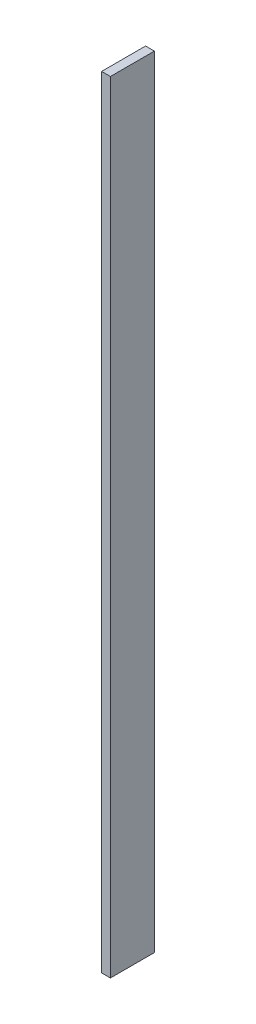
ISO-10303-21;
HEADER;
FILE_DESCRIPTION(('STEP AP214'),'2;1');
FILE_NAME('part.step','',(''),(''),'','','');
FILE_SCHEMA(('AUTOMOTIVE_DESIGN { 1 0 10303 214 1 1 1 1 }'));
ENDSEC;
DATA;
#1=APPLICATION_CONTEXT('core data for automotive mechanical design processes');
#2=APPLICATION_PROTOCOL_DEFINITION('international standard','automotive_design',2000,#1);
#3=PRODUCT_CONTEXT('',#1,'mechanical');
#4=PRODUCT('Part','Part','',(#3));
#5=PRODUCT_RELATED_PRODUCT_CATEGORY('part','',(#4));
#6=PRODUCT_DEFINITION_FORMATION('','',#4);
#7=PRODUCT_DEFINITION_CONTEXT('part definition',#1,'design');
#8=PRODUCT_DEFINITION('design','',#6,#7);
#9=PRODUCT_DEFINITION_SHAPE('','',#8);
#10=(LENGTH_UNIT() NAMED_UNIT(*) SI_UNIT(.MILLI.,.METRE.));
#11=(NAMED_UNIT(*) PLANE_ANGLE_UNIT() SI_UNIT($,.RADIAN.));
#12=(NAMED_UNIT(*) SI_UNIT($,.STERADIAN.) SOLID_ANGLE_UNIT());
#13=UNCERTAINTY_MEASURE_WITH_UNIT(LENGTH_MEASURE(1.E-05),#10,'distance_accuracy_value','');
#14=(GEOMETRIC_REPRESENTATION_CONTEXT(3) GLOBAL_UNCERTAINTY_ASSIGNED_CONTEXT((#13)) GLOBAL_UNIT_ASSIGNED_CONTEXT((#10,
#11,#12)) REPRESENTATION_CONTEXT('',''));
#15=CARTESIAN_POINT('',(0.,0.,0.));
#16=DIRECTION('',(0.,0.,1.));
#17=DIRECTION('',(1.,0.,0.));
#18=AXIS2_PLACEMENT_3D('',#15,#16,#17);
#19=CARTESIAN_POINT('',(0.188536082474265,901.7,25.104006109202));
#20=DIRECTION('',(-1.,0.,0.));
#21=DIRECTION('',(0.,0.,1.));
#22=AXIS2_PLACEMENT_3D('',#19,#20,#21);
#23=PLANE('',#22);
#24=DIRECTION('',(0.,0.,-1.));
#25=VECTOR('',#24,1.);
#26=CARTESIAN_POINT('',(0.188536082474265,0.,25.104006109202));
#27=LINE('',#26,#25);
#28=CARTESIAN_POINT('',(0.188536082474265,0.,25.104006109202));
#29=VERTEX_POINT('',#28);
#30=CARTESIAN_POINT('',(0.188536082474265,0.,-25.695993890798));
#31=VERTEX_POINT('',#30);
#32=EDGE_CURVE('E100',#29,#31,#27,.T.);
#33=ORIENTED_EDGE('',*,*,#32,.T.);
#34=DIRECTION('',(0.,-1.,0.));
#35=VECTOR('',#34,1.);
#36=CARTESIAN_POINT('',(0.188536082474265,901.7,-25.695993890798));
#37=LINE('',#36,#35);
#38=CARTESIAN_POINT('',(0.188536082474265,901.7,-25.695993890798));
#39=VERTEX_POINT('',#38);
#40=EDGE_CURVE('E11',#39,#31,#37,.T.);
#41=ORIENTED_EDGE('',*,*,#40,.F.);
#42=DIRECTION('',(0.,0.,-1.));
#43=VECTOR('',#42,1.);
#44=CARTESIAN_POINT('',(0.188536082474265,901.7,25.104006109202));
#45=LINE('',#44,#43);
#46=CARTESIAN_POINT('',(0.188536082474265,901.7,25.104006109202));
#47=VERTEX_POINT('',#46);
#48=EDGE_CURVE('E88',#47,#39,#45,.T.);
#49=ORIENTED_EDGE('',*,*,#48,.F.);
#50=DIRECTION('',(0.,-1.,0.));
#51=VECTOR('',#50,1.);
#52=CARTESIAN_POINT('',(0.188536082474265,901.7,25.104006109202));
#53=LINE('',#52,#51);
#54=EDGE_CURVE('E96',#47,#29,#53,.T.);
#55=ORIENTED_EDGE('',*,*,#54,.T.);
#56=EDGE_LOOP('',(#33,#41,#49,#55));
#57=FACE_BOUND('',#56,.T.);
#58=ADVANCED_FACE('F37',(#57),#23,.F.);
#59=CARTESIAN_POINT('',(-9.97146391752574,901.7,-25.695993890798));
#60=DIRECTION('',(0.,0.,1.));
#61=DIRECTION('',(1.,0.,0.));
#62=AXIS2_PLACEMENT_3D('',#59,#60,#61);
#63=PLANE('',#62);
#64=DIRECTION('',(-1.,0.,0.));
#65=VECTOR('',#64,1.);
#66=CARTESIAN_POINT('',(-9.97146391752574,0.,-25.695993890798));
#67=LINE('',#66,#65);
#68=CARTESIAN_POINT('',(-9.97146391752574,0.,-25.695993890798));
#69=VERTEX_POINT('',#68);
#70=EDGE_CURVE('E92',#31,#69,#67,.T.);
#71=ORIENTED_EDGE('',*,*,#70,.T.);
#72=DIRECTION('',(0.,-1.,0.));
#73=VECTOR('',#72,1.);
#74=CARTESIAN_POINT('',(-9.97146391752574,901.7,-25.695993890798));
#75=LINE('',#74,#73);
#76=CARTESIAN_POINT('',(-9.97146391752574,901.7,-25.695993890798));
#77=VERTEX_POINT('',#76);
#78=EDGE_CURVE('E45',#77,#69,#75,.T.);
#79=ORIENTED_EDGE('',*,*,#78,.F.);
#80=DIRECTION('',(-1.,0.,0.));
#81=VECTOR('',#80,1.);
#82=CARTESIAN_POINT('',(-9.97146391752574,901.7,-25.695993890798));
#83=LINE('',#82,#81);
#84=EDGE_CURVE('E83',#39,#77,#83,.T.);
#85=ORIENTED_EDGE('',*,*,#84,.F.);
#86=ORIENTED_EDGE('',*,*,#40,.T.);
#87=EDGE_LOOP('',(#71,#79,#85,#86));
#88=FACE_BOUND('',#87,.T.);
#89=ADVANCED_FACE('F91',(#88),#63,.F.);
#90=CARTESIAN_POINT('',(-9.97146391752574,901.7,25.104006109202));
#91=DIRECTION('',(1.,0.,0.));
#92=DIRECTION('',(0.,0.,-1.));
#93=AXIS2_PLACEMENT_3D('',#90,#91,#92);
#94=PLANE('',#93);
#95=DIRECTION('',(0.,0.,1.));
#96=VECTOR('',#95,1.);
#97=CARTESIAN_POINT('',(-9.97146391752574,0.,25.104006109202));
#98=LINE('',#97,#96);
#99=CARTESIAN_POINT('',(-9.97146391752574,0.,25.104006109202));
#100=VERTEX_POINT('',#99);
#101=EDGE_CURVE('E70',#69,#100,#98,.T.);
#102=ORIENTED_EDGE('',*,*,#101,.T.);
#103=DIRECTION('',(0.,-1.,0.));
#104=VECTOR('',#103,1.);
#105=CARTESIAN_POINT('',(-9.97146391752574,901.7,25.104006109202));
#106=LINE('',#105,#104);
#107=CARTESIAN_POINT('',(-9.97146391752574,901.7,25.104006109202));
#108=VERTEX_POINT('',#107);
#109=EDGE_CURVE('E93',#108,#100,#106,.T.);
#110=ORIENTED_EDGE('',*,*,#109,.F.);
#111=DIRECTION('',(0.,0.,1.));
#112=VECTOR('',#111,1.);
#113=CARTESIAN_POINT('',(-9.97146391752574,901.7,25.104006109202));
#114=LINE('',#113,#112);
#115=EDGE_CURVE('E86',#77,#108,#114,.T.);
#116=ORIENTED_EDGE('',*,*,#115,.F.);
#117=ORIENTED_EDGE('',*,*,#78,.T.);
#118=EDGE_LOOP('',(#102,#110,#116,#117));
#119=FACE_BOUND('',#118,.T.);
#120=ADVANCED_FACE('F94',(#119),#94,.F.);
#121=CARTESIAN_POINT('',(-9.97146391752574,901.7,25.104006109202));
#122=DIRECTION('',(0.,0.,-1.));
#123=DIRECTION('',(-1.,0.,0.));
#124=AXIS2_PLACEMENT_3D('',#121,#122,#123);
#125=PLANE('',#124);
#126=DIRECTION('',(1.,0.,0.));
#127=VECTOR('',#126,1.);
#128=CARTESIAN_POINT('',(-9.97146391752574,0.,25.104006109202));
#129=LINE('',#128,#127);
#130=EDGE_CURVE('E76',#100,#29,#129,.T.);
#131=ORIENTED_EDGE('',*,*,#130,.T.);
#132=ORIENTED_EDGE('',*,*,#54,.F.);
#133=DIRECTION('',(1.,0.,0.));
#134=VECTOR('',#133,1.);
#135=CARTESIAN_POINT('',(-9.97146391752574,901.7,25.104006109202));
#136=LINE('',#135,#134);
#137=EDGE_CURVE('E53',#108,#47,#136,.T.);
#138=ORIENTED_EDGE('',*,*,#137,.F.);
#139=ORIENTED_EDGE('',*,*,#109,.T.);
#140=EDGE_LOOP('',(#131,#132,#138,#139));
#141=FACE_BOUND('',#140,.T.);
#142=ADVANCED_FACE('F107',(#141),#125,.F.);
#143=CARTESIAN_POINT('',(0.,901.7,0.));
#144=DIRECTION('',(0.,-1.,0.));
#145=DIRECTION('',(0.,0.,-1.));
#146=AXIS2_PLACEMENT_3D('',#143,#144,#145);
#147=PLANE('',#146);
#148=ORIENTED_EDGE('',*,*,#48,.T.);
#149=ORIENTED_EDGE('',*,*,#84,.T.);
#150=ORIENTED_EDGE('',*,*,#115,.T.);
#151=ORIENTED_EDGE('',*,*,#137,.T.);
#152=EDGE_LOOP('',(#148,#149,#150,#151));
#153=FACE_BOUND('',#152,.T.);
#154=ADVANCED_FACE('F84',(#153),#147,.F.);
#155=CARTESIAN_POINT('',(0.,0.,0.));
#156=DIRECTION('',(0.,-1.,0.));
#157=DIRECTION('',(0.,0.,-1.));
#158=AXIS2_PLACEMENT_3D('',#155,#156,#157);
#159=PLANE('',#158);
#160=ORIENTED_EDGE('',*,*,#32,.F.);
#161=ORIENTED_EDGE('',*,*,#130,.F.);
#162=ORIENTED_EDGE('',*,*,#101,.F.);
#163=ORIENTED_EDGE('',*,*,#70,.F.);
#164=EDGE_LOOP('',(#160,#161,#162,#163));
#165=FACE_BOUND('',#164,.T.);
#166=ADVANCED_FACE('F110',(#165),#159,.T.);
#167=CLOSED_SHELL('',(#58,#89,#120,#142,#154,#166));
#168=MANIFOLD_SOLID_BREP('B2',#167);
#169=ADVANCED_BREP_SHAPE_REPRESENTATION('',(#18,#168),#14);
#170=SHAPE_DEFINITION_REPRESENTATION(#9,#169);
ENDSEC;
END-ISO-10303-21;
